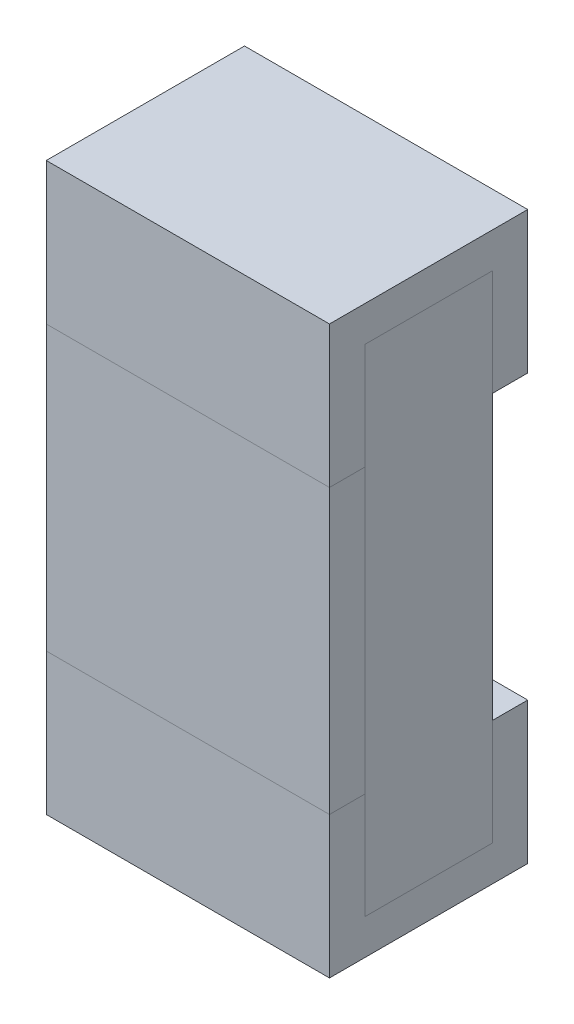
ISO-10303-21;
HEADER;
FILE_DESCRIPTION(('STEP AP214'),'2;1');
FILE_NAME('part.step','',(''),(''),'','','');
FILE_SCHEMA(('AUTOMOTIVE_DESIGN { 1 0 10303 214 1 1 1 1 }'));
ENDSEC;
DATA;
#1=APPLICATION_CONTEXT('core data for automotive mechanical design processes');
#2=APPLICATION_PROTOCOL_DEFINITION('international standard','automotive_design',2000,#1);
#3=PRODUCT_CONTEXT('',#1,'mechanical');
#4=PRODUCT('Part','Part','',(#3));
#5=PRODUCT_RELATED_PRODUCT_CATEGORY('part','',(#4));
#6=PRODUCT_DEFINITION_FORMATION('','',#4);
#7=PRODUCT_DEFINITION_CONTEXT('part definition',#1,'design');
#8=PRODUCT_DEFINITION('design','',#6,#7);
#9=PRODUCT_DEFINITION_SHAPE('','',#8);
#10=(LENGTH_UNIT() NAMED_UNIT(*) SI_UNIT(.MILLI.,.METRE.));
#11=(NAMED_UNIT(*) PLANE_ANGLE_UNIT() SI_UNIT($,.RADIAN.));
#12=(NAMED_UNIT(*) SI_UNIT($,.STERADIAN.) SOLID_ANGLE_UNIT());
#13=UNCERTAINTY_MEASURE_WITH_UNIT(LENGTH_MEASURE(1.E-05),#10,'distance_accuracy_value','');
#14=(GEOMETRIC_REPRESENTATION_CONTEXT(3) GLOBAL_UNCERTAINTY_ASSIGNED_CONTEXT((#13)) GLOBAL_UNIT_ASSIGNED_CONTEXT((#10,
#11,#12)) REPRESENTATION_CONTEXT('',''));
#15=CARTESIAN_POINT('',(0.,0.,0.));
#16=DIRECTION('',(0.,0.,1.));
#17=DIRECTION('',(1.,0.,0.));
#18=AXIS2_PLACEMENT_3D('',#15,#16,#17);
#19=CARTESIAN_POINT('',(-0.25,0.,0.));
#20=DIRECTION('',(1.,0.,0.));
#21=DIRECTION('',(0.,0.,-1.));
#22=AXIS2_PLACEMENT_3D('',#19,#20,#21);
#23=PLANE('',#22);
#24=DIRECTION('',(0.,-1.,0.));
#25=VECTOR('',#24,1.);
#26=CARTESIAN_POINT('',(-0.25,0.25,0.35));
#27=LINE('',#26,#25);
#28=CARTESIAN_POINT('',(-0.25,0.25,0.35));
#29=VERTEX_POINT('',#28);
#30=CARTESIAN_POINT('',(-0.25,0.,0.35));
#31=VERTEX_POINT('',#30);
#32=EDGE_CURVE('P0_E25',#29,#31,#27,.T.);
#33=ORIENTED_EDGE('',*,*,#32,.F.);
#34=DIRECTION('',(0.,0.,1.));
#35=VECTOR('',#34,1.);
#36=CARTESIAN_POINT('',(-0.25,0.25,0.2875));
#37=LINE('',#36,#35);
#38=CARTESIAN_POINT('',(-0.25,0.25,0.2875));
#39=VERTEX_POINT('',#38);
#40=EDGE_CURVE('P0_E171',#39,#29,#37,.T.);
#41=ORIENTED_EDGE('',*,*,#40,.F.);
#42=DIRECTION('',(0.,1.,0.));
#43=VECTOR('',#42,1.);
#44=CARTESIAN_POINT('',(-0.25,0.0625,0.2875));
#45=LINE('',#44,#43);
#46=CARTESIAN_POINT('',(-0.25,0.0625,0.2875));
#47=VERTEX_POINT('',#46);
#48=EDGE_CURVE('P0_E113',#47,#39,#45,.T.);
#49=ORIENTED_EDGE('',*,*,#48,.F.);
#50=DIRECTION('',(0.,0.,1.));
#51=VECTOR('',#50,1.);
#52=CARTESIAN_POINT('',(-0.25,0.0625,0.0625));
#53=LINE('',#52,#51);
#54=CARTESIAN_POINT('',(-0.25,0.0625,0.0625));
#55=VERTEX_POINT('',#54);
#56=EDGE_CURVE('P0_E124',#55,#47,#53,.T.);
#57=ORIENTED_EDGE('',*,*,#56,.F.);
#58=DIRECTION('',(0.,-1.,0.));
#59=VECTOR('',#58,1.);
#60=CARTESIAN_POINT('',(-0.25,0.25,0.0625));
#61=LINE('',#60,#59);
#62=CARTESIAN_POINT('',(-0.25,0.25,0.0625));
#63=VERTEX_POINT('',#62);
#64=EDGE_CURVE('P0_E127',#63,#55,#61,.T.);
#65=ORIENTED_EDGE('',*,*,#64,.F.);
#66=DIRECTION('',(0.,0.,1.));
#67=VECTOR('',#66,1.);
#68=CARTESIAN_POINT('',(-0.25,0.25,0.));
#69=LINE('',#68,#67);
#70=CARTESIAN_POINT('',(-0.25,0.25,0.));
#71=VERTEX_POINT('',#70);
#72=EDGE_CURVE('P0_E146',#71,#63,#69,.T.);
#73=ORIENTED_EDGE('',*,*,#72,.F.);
#74=DIRECTION('',(0.,1.,0.));
#75=VECTOR('',#74,1.);
#76=CARTESIAN_POINT('',(-0.25,0.,0.));
#77=LINE('',#76,#75);
#78=CARTESIAN_POINT('',(-0.25,0.,0.));
#79=VERTEX_POINT('',#78);
#80=EDGE_CURVE('P0_E142',#79,#71,#77,.T.);
#81=ORIENTED_EDGE('',*,*,#80,.F.);
#82=DIRECTION('',(0.,0.,-1.));
#83=VECTOR('',#82,1.);
#84=CARTESIAN_POINT('',(-0.25,0.,0.35));
#85=LINE('',#84,#83);
#86=EDGE_CURVE('P0_E196',#31,#79,#85,.T.);
#87=ORIENTED_EDGE('',*,*,#86,.F.);
#88=EDGE_LOOP('',(#33,#41,#49,#57,#65,#73,#81,#87));
#89=FACE_BOUND('',#88,.T.);
#90=ADVANCED_FACE('P0_F16',(#89),#23,.F.);
#91=CARTESIAN_POINT('',(0.25,0.,0.));
#92=DIRECTION('',(1.,0.,0.));
#93=DIRECTION('',(0.,0.,-1.));
#94=AXIS2_PLACEMENT_3D('',#91,#92,#93);
#95=PLANE('',#94);
#96=DIRECTION('',(0.,0.,-1.));
#97=VECTOR('',#96,1.);
#98=CARTESIAN_POINT('',(0.25,0.,0.35));
#99=LINE('',#98,#97);
#100=CARTESIAN_POINT('',(0.25,0.,0.35));
#101=VERTEX_POINT('',#100);
#102=CARTESIAN_POINT('',(0.25,0.,0.));
#103=VERTEX_POINT('',#102);
#104=EDGE_CURVE('P0_E137',#101,#103,#99,.T.);
#105=ORIENTED_EDGE('',*,*,#104,.T.);
#106=DIRECTION('',(0.,1.,0.));
#107=VECTOR('',#106,1.);
#108=CARTESIAN_POINT('',(0.25,0.,0.));
#109=LINE('',#108,#107);
#110=CARTESIAN_POINT('',(0.25,0.25,0.));
#111=VERTEX_POINT('',#110);
#112=EDGE_CURVE('P0_E150',#103,#111,#109,.T.);
#113=ORIENTED_EDGE('',*,*,#112,.T.);
#114=DIRECTION('',(0.,0.,1.));
#115=VECTOR('',#114,1.);
#116=CARTESIAN_POINT('',(0.25,0.25,0.));
#117=LINE('',#116,#115);
#118=CARTESIAN_POINT('',(0.25,0.25,0.0625));
#119=VERTEX_POINT('',#118);
#120=EDGE_CURVE('P0_E119',#111,#119,#117,.T.);
#121=ORIENTED_EDGE('',*,*,#120,.T.);
#122=DIRECTION('',(0.,-1.,0.));
#123=VECTOR('',#122,1.);
#124=CARTESIAN_POINT('',(0.25,0.25,0.0625));
#125=LINE('',#124,#123);
#126=CARTESIAN_POINT('',(0.25,0.0625,0.0625));
#127=VERTEX_POINT('',#126);
#128=EDGE_CURVE('P0_E116',#119,#127,#125,.T.);
#129=ORIENTED_EDGE('',*,*,#128,.T.);
#130=DIRECTION('',(0.,0.,1.));
#131=VECTOR('',#130,1.);
#132=CARTESIAN_POINT('',(0.25,0.0625,0.0625));
#133=LINE('',#132,#131);
#134=CARTESIAN_POINT('',(0.25,0.0625,0.2875));
#135=VERTEX_POINT('',#134);
#136=EDGE_CURVE('P0_E101',#127,#135,#133,.T.);
#137=ORIENTED_EDGE('',*,*,#136,.T.);
#138=DIRECTION('',(0.,1.,0.));
#139=VECTOR('',#138,1.);
#140=CARTESIAN_POINT('',(0.25,0.0625,0.2875));
#141=LINE('',#140,#139);
#142=CARTESIAN_POINT('',(0.25,0.25,0.2875));
#143=VERTEX_POINT('',#142);
#144=EDGE_CURVE('P0_E168',#135,#143,#141,.T.);
#145=ORIENTED_EDGE('',*,*,#144,.T.);
#146=DIRECTION('',(0.,0.,1.));
#147=VECTOR('',#146,1.);
#148=CARTESIAN_POINT('',(0.25,0.25,0.2875));
#149=LINE('',#148,#147);
#150=CARTESIAN_POINT('',(0.25,0.25,0.35));
#151=VERTEX_POINT('',#150);
#152=EDGE_CURVE('P0_E178',#143,#151,#149,.T.);
#153=ORIENTED_EDGE('',*,*,#152,.T.);
#154=DIRECTION('',(0.,-1.,0.));
#155=VECTOR('',#154,1.);
#156=CARTESIAN_POINT('',(0.25,0.25,0.35));
#157=LINE('',#156,#155);
#158=EDGE_CURVE('P0_E11',#151,#101,#157,.T.);
#159=ORIENTED_EDGE('',*,*,#158,.T.);
#160=EDGE_LOOP('',(#105,#113,#121,#129,#137,#145,#153,#159));
#161=FACE_BOUND('',#160,.T.);
#162=ADVANCED_FACE('P0_F18',(#161),#95,.T.);
#163=CARTESIAN_POINT('',(-0.25,0.25,0.35));
#164=DIRECTION('',(0.,0.,1.));
#165=DIRECTION('',(1.,0.,0.));
#166=AXIS2_PLACEMENT_3D('',#163,#164,#165);
#167=PLANE('',#166);
#168=ORIENTED_EDGE('',*,*,#32,.T.);
#169=DIRECTION('',(1.,0.,0.));
#170=VECTOR('',#169,1.);
#171=CARTESIAN_POINT('',(-0.25,0.,0.35));
#172=LINE('',#171,#170);
#173=EDGE_CURVE('P0_E139',#31,#101,#172,.T.);
#174=ORIENTED_EDGE('',*,*,#173,.T.);
#175=ORIENTED_EDGE('',*,*,#158,.F.);
#176=DIRECTION('',(1.,0.,0.));
#177=VECTOR('',#176,1.);
#178=CARTESIAN_POINT('',(-0.25,0.25,0.35));
#179=LINE('',#178,#177);
#180=EDGE_CURVE('P0_E175',#29,#151,#179,.T.);
#181=ORIENTED_EDGE('',*,*,#180,.F.);
#182=EDGE_LOOP('',(#168,#174,#175,#181));
#183=FACE_BOUND('',#182,.T.);
#184=ADVANCED_FACE('P0_F287',(#183),#167,.T.);
#185=CARTESIAN_POINT('',(-0.25,0.25,0.2875));
#186=DIRECTION('',(0.,1.,0.));
#187=DIRECTION('',(1.,0.,0.));
#188=AXIS2_PLACEMENT_3D('',#185,#186,#187);
#189=PLANE('',#188);
#190=ORIENTED_EDGE('',*,*,#40,.T.);
#191=ORIENTED_EDGE('',*,*,#180,.T.);
#192=ORIENTED_EDGE('',*,*,#152,.F.);
#193=DIRECTION('',(1.,0.,0.));
#194=VECTOR('',#193,1.);
#195=CARTESIAN_POINT('',(-0.25,0.25,0.2875));
#196=LINE('',#195,#194);
#197=EDGE_CURVE('P0_E164',#39,#143,#196,.T.);
#198=ORIENTED_EDGE('',*,*,#197,.F.);
#199=EDGE_LOOP('',(#190,#191,#192,#198));
#200=FACE_BOUND('',#199,.T.);
#201=ADVANCED_FACE('P0_F292',(#200),#189,.T.);
#202=CARTESIAN_POINT('',(-0.25,0.0625,0.2875));
#203=DIRECTION('',(0.,0.,-1.));
#204=DIRECTION('',(-1.,0.,0.));
#205=AXIS2_PLACEMENT_3D('',#202,#203,#204);
#206=PLANE('',#205);
#207=ORIENTED_EDGE('',*,*,#48,.T.);
#208=ORIENTED_EDGE('',*,*,#197,.T.);
#209=ORIENTED_EDGE('',*,*,#144,.F.);
#210=DIRECTION('',(1.,0.,0.));
#211=VECTOR('',#210,1.);
#212=CARTESIAN_POINT('',(-0.25,0.0625,0.2875));
#213=LINE('',#212,#211);
#214=EDGE_CURVE('P0_E109',#47,#135,#213,.T.);
#215=ORIENTED_EDGE('',*,*,#214,.F.);
#216=EDGE_LOOP('',(#207,#208,#209,#215));
#217=FACE_BOUND('',#216,.T.);
#218=ADVANCED_FACE('P0_F332',(#217),#206,.T.);
#219=CARTESIAN_POINT('',(-0.25,0.0625,0.0625));
#220=DIRECTION('',(0.,1.,0.));
#221=DIRECTION('',(0.,0.,-1.));
#222=AXIS2_PLACEMENT_3D('',#219,#220,#221);
#223=PLANE('',#222);
#224=ORIENTED_EDGE('',*,*,#56,.T.);
#225=ORIENTED_EDGE('',*,*,#214,.T.);
#226=ORIENTED_EDGE('',*,*,#136,.F.);
#227=DIRECTION('',(1.,0.,0.));
#228=VECTOR('',#227,1.);
#229=CARTESIAN_POINT('',(-0.25,0.0625,0.0625));
#230=LINE('',#229,#228);
#231=EDGE_CURVE('P0_E106',#55,#127,#230,.T.);
#232=ORIENTED_EDGE('',*,*,#231,.F.);
#233=EDGE_LOOP('',(#224,#225,#226,#232));
#234=FACE_BOUND('',#233,.T.);
#235=ADVANCED_FACE('P0_F104',(#234),#223,.T.);
#236=CARTESIAN_POINT('',(-0.25,0.25,0.0625));
#237=DIRECTION('',(0.,0.,1.));
#238=DIRECTION('',(1.,0.,0.));
#239=AXIS2_PLACEMENT_3D('',#236,#237,#238);
#240=PLANE('',#239);
#241=ORIENTED_EDGE('',*,*,#64,.T.);
#242=ORIENTED_EDGE('',*,*,#231,.T.);
#243=ORIENTED_EDGE('',*,*,#128,.F.);
#244=DIRECTION('',(1.,0.,0.));
#245=VECTOR('',#244,1.);
#246=CARTESIAN_POINT('',(-0.25,0.25,0.0625));
#247=LINE('',#246,#245);
#248=EDGE_CURVE('P0_E143',#63,#119,#247,.T.);
#249=ORIENTED_EDGE('',*,*,#248,.F.);
#250=EDGE_LOOP('',(#241,#242,#243,#249));
#251=FACE_BOUND('',#250,.T.);
#252=ADVANCED_FACE('P0_F126',(#251),#240,.T.);
#253=CARTESIAN_POINT('',(-0.25,0.25,0.));
#254=DIRECTION('',(0.,1.,0.));
#255=DIRECTION('',(0.,0.,-1.));
#256=AXIS2_PLACEMENT_3D('',#253,#254,#255);
#257=PLANE('',#256);
#258=ORIENTED_EDGE('',*,*,#72,.T.);
#259=ORIENTED_EDGE('',*,*,#248,.T.);
#260=ORIENTED_EDGE('',*,*,#120,.F.);
#261=DIRECTION('',(1.,0.,0.));
#262=VECTOR('',#261,1.);
#263=CARTESIAN_POINT('',(-0.25,0.25,0.));
#264=LINE('',#263,#262);
#265=EDGE_CURVE('P0_E147',#71,#111,#264,.T.);
#266=ORIENTED_EDGE('',*,*,#265,.F.);
#267=EDGE_LOOP('',(#258,#259,#260,#266));
#268=FACE_BOUND('',#267,.T.);
#269=ADVANCED_FACE('P0_F303',(#268),#257,.T.);
#270=CARTESIAN_POINT('',(-0.25,0.,0.));
#271=DIRECTION('',(0.,0.,-1.));
#272=DIRECTION('',(-1.,0.,0.));
#273=AXIS2_PLACEMENT_3D('',#270,#271,#272);
#274=PLANE('',#273);
#275=ORIENTED_EDGE('',*,*,#80,.T.);
#276=ORIENTED_EDGE('',*,*,#265,.T.);
#277=ORIENTED_EDGE('',*,*,#112,.F.);
#278=DIRECTION('',(1.,0.,0.));
#279=VECTOR('',#278,1.);
#280=CARTESIAN_POINT('',(-0.25,0.,0.));
#281=LINE('',#280,#279);
#282=EDGE_CURVE('P0_E192',#79,#103,#281,.T.);
#283=ORIENTED_EDGE('',*,*,#282,.F.);
#284=EDGE_LOOP('',(#275,#276,#277,#283));
#285=FACE_BOUND('',#284,.T.);
#286=ADVANCED_FACE('P0_F207',(#285),#274,.T.);
#287=CARTESIAN_POINT('',(-0.25,0.,0.35));
#288=DIRECTION('',(0.,-1.,0.));
#289=DIRECTION('',(0.,0.,-1.));
#290=AXIS2_PLACEMENT_3D('',#287,#288,#289);
#291=PLANE('',#290);
#292=ORIENTED_EDGE('',*,*,#86,.T.);
#293=ORIENTED_EDGE('',*,*,#282,.T.);
#294=ORIENTED_EDGE('',*,*,#104,.F.);
#295=ORIENTED_EDGE('',*,*,#173,.F.);
#296=EDGE_LOOP('',(#292,#293,#294,#295));
#297=FACE_BOUND('',#296,.T.);
#298=ADVANCED_FACE('P0_F202',(#297),#291,.T.);
#299=CLOSED_SHELL('',(#90,#162,#184,#201,#218,#235,#252,#269,#286,#298));
#300=MANIFOLD_SOLID_BREP('P0_B1',#299);
#301=CARTESIAN_POINT('',(-0.25,0.75,0.));
#302=DIRECTION('',(0.,1.,0.));
#303=DIRECTION('',(0.,0.,-1.));
#304=AXIS2_PLACEMENT_3D('',#301,#302,#303);
#305=PLANE('',#304);
#306=DIRECTION('',(1.,0.,0.));
#307=VECTOR('',#306,1.);
#308=CARTESIAN_POINT('',(-0.25,0.75,0.));
#309=LINE('',#308,#307);
#310=CARTESIAN_POINT('',(-0.25,0.75,0.));
#311=VERTEX_POINT('',#310);
#312=CARTESIAN_POINT('',(0.25,0.75,0.));
#313=VERTEX_POINT('',#312);
#314=EDGE_CURVE('P1_E104',#311,#313,#309,.T.);
#315=ORIENTED_EDGE('',*,*,#314,.T.);
#316=DIRECTION('',(0.,0.,1.));
#317=VECTOR('',#316,1.);
#318=CARTESIAN_POINT('',(0.25,0.75,0.));
#319=LINE('',#318,#317);
#320=CARTESIAN_POINT('',(0.25,0.75,0.0625));
#321=VERTEX_POINT('',#320);
#322=EDGE_CURVE('P1_E81',#313,#321,#319,.T.);
#323=ORIENTED_EDGE('',*,*,#322,.T.);
#324=DIRECTION('',(1.,0.,0.));
#325=VECTOR('',#324,1.);
#326=CARTESIAN_POINT('',(-0.25,0.75,0.0625));
#327=LINE('',#326,#325);
#328=CARTESIAN_POINT('',(-0.25,0.75,0.0625));
#329=VERTEX_POINT('',#328);
#330=EDGE_CURVE('P1_E11',#329,#321,#327,.T.);
#331=ORIENTED_EDGE('',*,*,#330,.F.);
#332=DIRECTION('',(0.,0.,1.));
#333=VECTOR('',#332,1.);
#334=CARTESIAN_POINT('',(-0.25,0.75,0.));
#335=LINE('',#334,#333);
#336=EDGE_CURVE('P1_E78',#311,#329,#335,.T.);
#337=ORIENTED_EDGE('',*,*,#336,.F.);
#338=EDGE_LOOP('',(#315,#323,#331,#337));
#339=FACE_BOUND('',#338,.T.);
#340=ADVANCED_FACE('P1_F16',(#339),#305,.F.);
#341=CARTESIAN_POINT('',(-0.25,0.75,0.0625));
#342=DIRECTION('',(0.,0.,-1.));
#343=DIRECTION('',(-1.,0.,0.));
#344=AXIS2_PLACEMENT_3D('',#341,#342,#343);
#345=PLANE('',#344);
#346=ORIENTED_EDGE('',*,*,#330,.T.);
#347=DIRECTION('',(0.,1.,0.));
#348=VECTOR('',#347,1.);
#349=CARTESIAN_POINT('',(0.25,0.75,0.0625));
#350=LINE('',#349,#348);
#351=CARTESIAN_POINT('',(0.25,0.9375,0.0625));
#352=VERTEX_POINT('',#351);
#353=EDGE_CURVE('P1_E140',#321,#352,#350,.T.);
#354=ORIENTED_EDGE('',*,*,#353,.T.);
#355=DIRECTION('',(1.,0.,0.));
#356=VECTOR('',#355,1.);
#357=CARTESIAN_POINT('',(-0.25,0.9375,0.0625));
#358=LINE('',#357,#356);
#359=CARTESIAN_POINT('',(-0.25,0.9375,0.0625));
#360=VERTEX_POINT('',#359);
#361=EDGE_CURVE('P1_E24',#360,#352,#358,.T.);
#362=ORIENTED_EDGE('',*,*,#361,.F.);
#363=DIRECTION('',(0.,1.,0.));
#364=VECTOR('',#363,1.);
#365=CARTESIAN_POINT('',(-0.25,0.75,0.0625));
#366=LINE('',#365,#364);
#367=EDGE_CURVE('P1_E86',#329,#360,#366,.T.);
#368=ORIENTED_EDGE('',*,*,#367,.F.);
#369=EDGE_LOOP('',(#346,#354,#362,#368));
#370=FACE_BOUND('',#369,.T.);
#371=ADVANCED_FACE('P1_F87',(#370),#345,.F.);
#372=CARTESIAN_POINT('',(-0.25,0.9375,0.0625));
#373=DIRECTION('',(0.,1.,0.));
#374=DIRECTION('',(0.,0.,-1.));
#375=AXIS2_PLACEMENT_3D('',#372,#373,#374);
#376=PLANE('',#375);
#377=ORIENTED_EDGE('',*,*,#361,.T.);
#378=DIRECTION('',(0.,0.,1.));
#379=VECTOR('',#378,1.);
#380=CARTESIAN_POINT('',(0.25,0.9375,0.0625));
#381=LINE('',#380,#379);
#382=CARTESIAN_POINT('',(0.25,0.9375,0.2875));
#383=VERTEX_POINT('',#382);
#384=EDGE_CURVE('P1_E137',#352,#383,#381,.T.);
#385=ORIENTED_EDGE('',*,*,#384,.T.);
#386=DIRECTION('',(1.,0.,0.));
#387=VECTOR('',#386,1.);
#388=CARTESIAN_POINT('',(-0.25,0.9375,0.2875));
#389=LINE('',#388,#387);
#390=CARTESIAN_POINT('',(-0.25,0.9375,0.2875));
#391=VERTEX_POINT('',#390);
#392=EDGE_CURVE('P1_E49',#391,#383,#389,.T.);
#393=ORIENTED_EDGE('',*,*,#392,.F.);
#394=DIRECTION('',(0.,0.,1.));
#395=VECTOR('',#394,1.);
#396=CARTESIAN_POINT('',(-0.25,0.9375,0.0625));
#397=LINE('',#396,#395);
#398=EDGE_CURVE('P1_E91',#360,#391,#397,.T.);
#399=ORIENTED_EDGE('',*,*,#398,.F.);
#400=EDGE_LOOP('',(#377,#385,#393,#399));
#401=FACE_BOUND('',#400,.T.);
#402=ADVANCED_FACE('P1_F164',(#401),#376,.F.);
#403=CARTESIAN_POINT('',(-0.25,0.9375,0.2875));
#404=DIRECTION('',(0.,0.,1.));
#405=DIRECTION('',(0.,-1.,0.));
#406=AXIS2_PLACEMENT_3D('',#403,#404,#405);
#407=PLANE('',#406);
#408=ORIENTED_EDGE('',*,*,#392,.T.);
#409=DIRECTION('',(0.,-1.,0.));
#410=VECTOR('',#409,1.);
#411=CARTESIAN_POINT('',(0.25,0.9375,0.2875));
#412=LINE('',#411,#410);
#413=CARTESIAN_POINT('',(0.25,0.75,0.2875));
#414=VERTEX_POINT('',#413);
#415=EDGE_CURVE('P1_E108',#383,#414,#412,.T.);
#416=ORIENTED_EDGE('',*,*,#415,.T.);
#417=DIRECTION('',(1.,0.,0.));
#418=VECTOR('',#417,1.);
#419=CARTESIAN_POINT('',(-0.25,0.75,0.2875));
#420=LINE('',#419,#418);
#421=CARTESIAN_POINT('',(-0.25,0.75,0.2875));
#422=VERTEX_POINT('',#421);
#423=EDGE_CURVE('P1_E36',#422,#414,#420,.T.);
#424=ORIENTED_EDGE('',*,*,#423,.F.);
#425=DIRECTION('',(0.,-1.,0.));
#426=VECTOR('',#425,1.);
#427=CARTESIAN_POINT('',(-0.25,0.9375,0.2875));
#428=LINE('',#427,#426);
#429=EDGE_CURVE('P1_E150',#391,#422,#428,.T.);
#430=ORIENTED_EDGE('',*,*,#429,.F.);
#431=EDGE_LOOP('',(#408,#416,#424,#430));
#432=FACE_BOUND('',#431,.T.);
#433=ADVANCED_FACE('P1_F247',(#432),#407,.F.);
#434=CARTESIAN_POINT('',(-0.25,0.75,0.2875));
#435=DIRECTION('',(0.,1.,0.));
#436=DIRECTION('',(0.,0.,-1.));
#437=AXIS2_PLACEMENT_3D('',#434,#435,#436);
#438=PLANE('',#437);
#439=ORIENTED_EDGE('',*,*,#423,.T.);
#440=DIRECTION('',(0.,0.,1.));
#441=VECTOR('',#440,1.);
#442=CARTESIAN_POINT('',(0.25,0.75,0.2875));
#443=LINE('',#442,#441);
#444=CARTESIAN_POINT('',(0.25,0.75,0.35));
#445=VERTEX_POINT('',#444);
#446=EDGE_CURVE('P1_E133',#414,#445,#443,.T.);
#447=ORIENTED_EDGE('',*,*,#446,.T.);
#448=DIRECTION('',(1.,0.,0.));
#449=VECTOR('',#448,1.);
#450=CARTESIAN_POINT('',(-0.25,0.75,0.35));
#451=LINE('',#450,#449);
#452=CARTESIAN_POINT('',(-0.25,0.75,0.35));
#453=VERTEX_POINT('',#452);
#454=EDGE_CURVE('P1_E117',#453,#445,#451,.T.);
#455=ORIENTED_EDGE('',*,*,#454,.F.);
#456=DIRECTION('',(0.,0.,1.));
#457=VECTOR('',#456,1.);
#458=CARTESIAN_POINT('',(-0.25,0.75,0.2875));
#459=LINE('',#458,#457);
#460=EDGE_CURVE('P1_E154',#422,#453,#459,.T.);
#461=ORIENTED_EDGE('',*,*,#460,.F.);
#462=EDGE_LOOP('',(#439,#447,#455,#461));
#463=FACE_BOUND('',#462,.T.);
#464=ADVANCED_FACE('P1_F246',(#463),#438,.F.);
#465=CARTESIAN_POINT('',(-0.25,1.,0.));
#466=DIRECTION('',(-1.,0.,0.));
#467=DIRECTION('',(0.,1.,0.));
#468=AXIS2_PLACEMENT_3D('',#465,#466,#467);
#469=PLANE('',#468);
#470=DIRECTION('',(0.,0.,-1.));
#471=VECTOR('',#470,1.);
#472=CARTESIAN_POINT('',(-0.25,1.,0.35));
#473=LINE('',#472,#471);
#474=CARTESIAN_POINT('',(-0.25,1.,0.35));
#475=VERTEX_POINT('',#474);
#476=CARTESIAN_POINT('',(-0.25,1.,0.));
#477=VERTEX_POINT('',#476);
#478=EDGE_CURVE('P1_E114',#475,#477,#473,.T.);
#479=ORIENTED_EDGE('',*,*,#478,.T.);
#480=DIRECTION('',(0.,-1.,0.));
#481=VECTOR('',#480,1.);
#482=CARTESIAN_POINT('',(-0.25,1.,0.));
#483=LINE('',#482,#481);
#484=EDGE_CURVE('P1_E96',#477,#311,#483,.T.);
#485=ORIENTED_EDGE('',*,*,#484,.T.);
#486=ORIENTED_EDGE('',*,*,#336,.T.);
#487=ORIENTED_EDGE('',*,*,#367,.T.);
#488=ORIENTED_EDGE('',*,*,#398,.T.);
#489=ORIENTED_EDGE('',*,*,#429,.T.);
#490=ORIENTED_EDGE('',*,*,#460,.T.);
#491=DIRECTION('',(0.,1.,0.));
#492=VECTOR('',#491,1.);
#493=CARTESIAN_POINT('',(-0.25,0.75,0.35));
#494=LINE('',#493,#492);
#495=EDGE_CURVE('P1_E129',#453,#475,#494,.T.);
#496=ORIENTED_EDGE('',*,*,#495,.T.);
#497=EDGE_LOOP('',(#479,#485,#486,#487,#488,#489,#490,#496));
#498=FACE_BOUND('',#497,.T.);
#499=ADVANCED_FACE('P1_F94',(#498),#469,.T.);
#500=CARTESIAN_POINT('',(-0.25,1.,0.));
#501=DIRECTION('',(0.,0.,1.));
#502=DIRECTION('',(1.,0.,0.));
#503=AXIS2_PLACEMENT_3D('',#500,#501,#502);
#504=PLANE('',#503);
#505=DIRECTION('',(1.,0.,0.));
#506=VECTOR('',#505,1.);
#507=CARTESIAN_POINT('',(-0.25,1.,0.));
#508=LINE('',#507,#506);
#509=CARTESIAN_POINT('',(0.25,1.,0.));
#510=VERTEX_POINT('',#509);
#511=EDGE_CURVE('P1_E110',#477,#510,#508,.T.);
#512=ORIENTED_EDGE('',*,*,#511,.T.);
#513=DIRECTION('',(0.,-1.,0.));
#514=VECTOR('',#513,1.);
#515=CARTESIAN_POINT('',(0.25,1.,0.));
#516=LINE('',#515,#514);
#517=EDGE_CURVE('P1_E125',#510,#313,#516,.T.);
#518=ORIENTED_EDGE('',*,*,#517,.T.);
#519=ORIENTED_EDGE('',*,*,#314,.F.);
#520=ORIENTED_EDGE('',*,*,#484,.F.);
#521=EDGE_LOOP('',(#512,#518,#519,#520));
#522=FACE_BOUND('',#521,.T.);
#523=ADVANCED_FACE('P1_F267',(#522),#504,.F.);
#524=CARTESIAN_POINT('',(0.25,1.,0.));
#525=DIRECTION('',(-1.,0.,0.));
#526=DIRECTION('',(0.,1.,0.));
#527=AXIS2_PLACEMENT_3D('',#524,#525,#526);
#528=PLANE('',#527);
#529=DIRECTION('',(0.,1.,0.));
#530=VECTOR('',#529,1.);
#531=CARTESIAN_POINT('',(0.25,0.75,0.35));
#532=LINE('',#531,#530);
#533=CARTESIAN_POINT('',(0.25,1.,0.35));
#534=VERTEX_POINT('',#533);
#535=EDGE_CURVE('P1_E122',#445,#534,#532,.T.);
#536=ORIENTED_EDGE('',*,*,#535,.F.);
#537=ORIENTED_EDGE('',*,*,#446,.F.);
#538=ORIENTED_EDGE('',*,*,#415,.F.);
#539=ORIENTED_EDGE('',*,*,#384,.F.);
#540=ORIENTED_EDGE('',*,*,#353,.F.);
#541=ORIENTED_EDGE('',*,*,#322,.F.);
#542=ORIENTED_EDGE('',*,*,#517,.F.);
#543=DIRECTION('',(0.,0.,-1.));
#544=VECTOR('',#543,1.);
#545=CARTESIAN_POINT('',(0.25,1.,0.35));
#546=LINE('',#545,#544);
#547=EDGE_CURVE('P1_E115',#534,#510,#546,.T.);
#548=ORIENTED_EDGE('',*,*,#547,.F.);
#549=EDGE_LOOP('',(#536,#537,#538,#539,#540,#541,#542,#548));
#550=FACE_BOUND('',#549,.T.);
#551=ADVANCED_FACE('P1_F169',(#550),#528,.F.);
#552=CARTESIAN_POINT('',(-0.25,0.75,0.35));
#553=DIRECTION('',(0.,0.,-1.));
#554=DIRECTION('',(-1.,0.,0.));
#555=AXIS2_PLACEMENT_3D('',#552,#553,#554);
#556=PLANE('',#555);
#557=ORIENTED_EDGE('',*,*,#454,.T.);
#558=ORIENTED_EDGE('',*,*,#535,.T.);
#559=DIRECTION('',(1.,0.,0.));
#560=VECTOR('',#559,1.);
#561=CARTESIAN_POINT('',(-0.25,1.,0.35));
#562=LINE('',#561,#560);
#563=EDGE_CURVE('P1_E204',#475,#534,#562,.T.);
#564=ORIENTED_EDGE('',*,*,#563,.F.);
#565=ORIENTED_EDGE('',*,*,#495,.F.);
#566=EDGE_LOOP('',(#557,#558,#564,#565));
#567=FACE_BOUND('',#566,.T.);
#568=ADVANCED_FACE('P1_F226',(#567),#556,.F.);
#569=CARTESIAN_POINT('',(-0.25,1.,0.35));
#570=DIRECTION('',(0.,-1.,0.));
#571=DIRECTION('',(0.,0.,-1.));
#572=AXIS2_PLACEMENT_3D('',#569,#570,#571);
#573=PLANE('',#572);
#574=ORIENTED_EDGE('',*,*,#563,.T.);
#575=ORIENTED_EDGE('',*,*,#547,.T.);
#576=ORIENTED_EDGE('',*,*,#511,.F.);
#577=ORIENTED_EDGE('',*,*,#478,.F.);
#578=EDGE_LOOP('',(#574,#575,#576,#577));
#579=FACE_BOUND('',#578,.T.);
#580=ADVANCED_FACE('P1_F217',(#579),#573,.F.);
#581=CLOSED_SHELL('',(#340,#371,#402,#433,#464,#499,#523,#551,#568,#580));
#582=MANIFOLD_SOLID_BREP('P1_B1',#581);
#583=CARTESIAN_POINT('',(0.25,0.,0.));
#584=DIRECTION('',(1.,0.,0.));
#585=DIRECTION('',(0.,0.,-1.));
#586=AXIS2_PLACEMENT_3D('',#583,#584,#585);
#587=PLANE('',#586);
#588=DIRECTION('',(0.,-1.,0.));
#589=VECTOR('',#588,1.);
#590=CARTESIAN_POINT('',(0.25,0.9375,0.2875));
#591=LINE('',#590,#589);
#592=CARTESIAN_POINT('',(0.25,0.9375,0.2875));
#593=VERTEX_POINT('',#592);
#594=CARTESIAN_POINT('',(0.25,0.0625,0.2875));
#595=VERTEX_POINT('',#594);
#596=EDGE_CURVE('P2_E11',#593,#595,#591,.T.);
#597=ORIENTED_EDGE('',*,*,#596,.T.);
#598=DIRECTION('',(0.,0.,-1.));
#599=VECTOR('',#598,1.);
#600=CARTESIAN_POINT('',(0.25,0.0625,0.2875));
#601=LINE('',#600,#599);
#602=CARTESIAN_POINT('',(0.25,0.0625,0.0625));
#603=VERTEX_POINT('',#602);
#604=EDGE_CURVE('P2_E41',#595,#603,#601,.T.);
#605=ORIENTED_EDGE('',*,*,#604,.T.);
#606=DIRECTION('',(0.,1.,0.));
#607=VECTOR('',#606,1.);
#608=CARTESIAN_POINT('',(0.25,0.0625,0.0625));
#609=LINE('',#608,#607);
#610=CARTESIAN_POINT('',(0.25,0.9375,0.0625));
#611=VERTEX_POINT('',#610);
#612=EDGE_CURVE('P2_E102',#603,#611,#609,.T.);
#613=ORIENTED_EDGE('',*,*,#612,.T.);
#614=DIRECTION('',(0.,0.,1.));
#615=VECTOR('',#614,1.);
#616=CARTESIAN_POINT('',(0.25,0.9375,0.0625));
#617=LINE('',#616,#615);
#618=EDGE_CURVE('P2_E103',#611,#593,#617,.T.);
#619=ORIENTED_EDGE('',*,*,#618,.T.);
#620=EDGE_LOOP('',(#597,#605,#613,#619));
#621=FACE_BOUND('',#620,.T.);
#622=ADVANCED_FACE('P2_F16',(#621),#587,.T.);
#623=CARTESIAN_POINT('',(-1.25,0.9375,0.2875));
#624=DIRECTION('',(0.,0.,1.));
#625=DIRECTION('',(1.,0.,0.));
#626=AXIS2_PLACEMENT_3D('',#623,#624,#625);
#627=PLANE('',#626);
#628=DIRECTION('',(0.,1.,0.));
#629=VECTOR('',#628,1.);
#630=CARTESIAN_POINT('',(-0.25,0.9375,0.2875));
#631=LINE('',#630,#629);
#632=CARTESIAN_POINT('',(-0.25,0.0625,0.2875));
#633=VERTEX_POINT('',#632);
#634=CARTESIAN_POINT('',(-0.25,0.9375,0.2875));
#635=VERTEX_POINT('',#634);
#636=EDGE_CURVE('P2_E78',#633,#635,#631,.T.);
#637=ORIENTED_EDGE('',*,*,#636,.F.);
#638=DIRECTION('',(1.,0.,0.));
#639=VECTOR('',#638,1.);
#640=CARTESIAN_POINT('',(-0.25,0.0625,0.2875));
#641=LINE('',#640,#639);
#642=EDGE_CURVE('P2_E24',#633,#595,#641,.T.);
#643=ORIENTED_EDGE('',*,*,#642,.T.);
#644=ORIENTED_EDGE('',*,*,#596,.F.);
#645=DIRECTION('',(1.,0.,0.));
#646=VECTOR('',#645,1.);
#647=CARTESIAN_POINT('',(-0.25,0.9375,0.2875));
#648=LINE('',#647,#646);
#649=EDGE_CURVE('P2_E82',#635,#593,#648,.T.);
#650=ORIENTED_EDGE('',*,*,#649,.F.);
#651=EDGE_LOOP('',(#637,#643,#644,#650));
#652=FACE_BOUND('',#651,.T.);
#653=ADVANCED_FACE('P2_F84',(#652),#627,.T.);
#654=CARTESIAN_POINT('',(-1.25,0.0625,0.2875));
#655=DIRECTION('',(0.,-1.,0.));
#656=DIRECTION('',(0.,0.,-1.));
#657=AXIS2_PLACEMENT_3D('',#654,#655,#656);
#658=PLANE('',#657);
#659=DIRECTION('',(0.,0.,1.));
#660=VECTOR('',#659,1.);
#661=CARTESIAN_POINT('',(-0.25,0.0625,0.2875));
#662=LINE('',#661,#660);
#663=CARTESIAN_POINT('',(-0.25,0.0625,0.0625));
#664=VERTEX_POINT('',#663);
#665=EDGE_CURVE('P2_E69',#664,#633,#662,.T.);
#666=ORIENTED_EDGE('',*,*,#665,.F.);
#667=DIRECTION('',(1.,0.,0.));
#668=VECTOR('',#667,1.);
#669=CARTESIAN_POINT('',(-0.25,0.0625,0.0625));
#670=LINE('',#669,#668);
#671=EDGE_CURVE('P2_E110',#664,#603,#670,.T.);
#672=ORIENTED_EDGE('',*,*,#671,.T.);
#673=ORIENTED_EDGE('',*,*,#604,.F.);
#674=ORIENTED_EDGE('',*,*,#642,.F.);
#675=EDGE_LOOP('',(#666,#672,#673,#674));
#676=FACE_BOUND('',#675,.T.);
#677=ADVANCED_FACE('P2_F68',(#676),#658,.T.);
#678=CARTESIAN_POINT('',(-1.25,0.0625,0.0625));
#679=DIRECTION('',(0.,0.,-1.));
#680=DIRECTION('',(-1.,0.,0.));
#681=AXIS2_PLACEMENT_3D('',#678,#679,#680);
#682=PLANE('',#681);
#683=DIRECTION('',(0.,-1.,0.));
#684=VECTOR('',#683,1.);
#685=CARTESIAN_POINT('',(-0.25,0.0625,0.0625));
#686=LINE('',#685,#684);
#687=CARTESIAN_POINT('',(-0.25,0.9375,0.0625));
#688=VERTEX_POINT('',#687);
#689=EDGE_CURVE('P2_E80',#688,#664,#686,.T.);
#690=ORIENTED_EDGE('',*,*,#689,.F.);
#691=DIRECTION('',(1.,0.,0.));
#692=VECTOR('',#691,1.);
#693=CARTESIAN_POINT('',(-0.25,0.9375,0.0625));
#694=LINE('',#693,#692);
#695=EDGE_CURVE('P2_E98',#688,#611,#694,.T.);
#696=ORIENTED_EDGE('',*,*,#695,.T.);
#697=ORIENTED_EDGE('',*,*,#612,.F.);
#698=ORIENTED_EDGE('',*,*,#671,.F.);
#699=EDGE_LOOP('',(#690,#696,#697,#698));
#700=FACE_BOUND('',#699,.T.);
#701=ADVANCED_FACE('P2_F118',(#700),#682,.T.);
#702=CARTESIAN_POINT('',(-1.25,0.9375,0.0625));
#703=DIRECTION('',(0.,1.,0.));
#704=DIRECTION('',(1.,0.,0.));
#705=AXIS2_PLACEMENT_3D('',#702,#703,#704);
#706=PLANE('',#705);
#707=DIRECTION('',(0.,0.,-1.));
#708=VECTOR('',#707,1.);
#709=CARTESIAN_POINT('',(-0.25,0.9375,0.0625));
#710=LINE('',#709,#708);
#711=EDGE_CURVE('P2_E88',#635,#688,#710,.T.);
#712=ORIENTED_EDGE('',*,*,#711,.F.);
#713=ORIENTED_EDGE('',*,*,#649,.T.);
#714=ORIENTED_EDGE('',*,*,#618,.F.);
#715=ORIENTED_EDGE('',*,*,#695,.F.);
#716=EDGE_LOOP('',(#712,#713,#714,#715));
#717=FACE_BOUND('',#716,.T.);
#718=ADVANCED_FACE('P2_F121',(#717),#706,.T.);
#719=CARTESIAN_POINT('',(-0.25,0.,0.));
#720=DIRECTION('',(1.,0.,0.));
#721=DIRECTION('',(0.,0.,-1.));
#722=AXIS2_PLACEMENT_3D('',#719,#720,#721);
#723=PLANE('',#722);
#724=ORIENTED_EDGE('',*,*,#636,.T.);
#725=ORIENTED_EDGE('',*,*,#711,.T.);
#726=ORIENTED_EDGE('',*,*,#689,.T.);
#727=ORIENTED_EDGE('',*,*,#665,.T.);
#728=EDGE_LOOP('',(#724,#725,#726,#727));
#729=FACE_BOUND('',#728,.T.);
#730=ADVANCED_FACE('P2_F76',(#729),#723,.F.);
#731=CLOSED_SHELL('',(#622,#653,#677,#701,#718,#730));
#732=MANIFOLD_SOLID_BREP('P2_B1',#731);
#733=CARTESIAN_POINT('',(0.25,0.,0.));
#734=DIRECTION('',(1.,0.,0.));
#735=DIRECTION('',(0.,0.,-1.));
#736=AXIS2_PLACEMENT_3D('',#733,#734,#735);
#737=PLANE('',#736);
#738=DIRECTION('',(0.,-1.,0.));
#739=VECTOR('',#738,1.);
#740=CARTESIAN_POINT('',(0.25,0.75,0.35));
#741=LINE('',#740,#739);
#742=CARTESIAN_POINT('',(0.25,0.75,0.35));
#743=VERTEX_POINT('',#742);
#744=CARTESIAN_POINT('',(0.25,0.25,0.35));
#745=VERTEX_POINT('',#744);
#746=EDGE_CURVE('P3_E11',#743,#745,#741,.T.);
#747=ORIENTED_EDGE('',*,*,#746,.T.);
#748=DIRECTION('',(0.,0.,-1.));
#749=VECTOR('',#748,1.);
#750=CARTESIAN_POINT('',(0.25,0.25,0.35));
#751=LINE('',#750,#749);
#752=CARTESIAN_POINT('',(0.25,0.25,0.2875));
#753=VERTEX_POINT('',#752);
#754=EDGE_CURVE('P3_E103',#745,#753,#751,.T.);
#755=ORIENTED_EDGE('',*,*,#754,.T.);
#756=DIRECTION('',(0.,1.,0.));
#757=VECTOR('',#756,1.);
#758=CARTESIAN_POINT('',(0.25,0.25,0.2875));
#759=LINE('',#758,#757);
#760=CARTESIAN_POINT('',(0.25,0.75,0.2875));
#761=VERTEX_POINT('',#760);
#762=EDGE_CURVE('P3_E46',#753,#761,#759,.T.);
#763=ORIENTED_EDGE('',*,*,#762,.T.);
#764=DIRECTION('',(0.,0.,1.));
#765=VECTOR('',#764,1.);
#766=CARTESIAN_POINT('',(0.25,0.75,0.2875));
#767=LINE('',#766,#765);
#768=EDGE_CURVE('P3_E76',#761,#743,#767,.T.);
#769=ORIENTED_EDGE('',*,*,#768,.T.);
#770=EDGE_LOOP('',(#747,#755,#763,#769));
#771=FACE_BOUND('',#770,.T.);
#772=ADVANCED_FACE('P3_F16',(#771),#737,.T.);
#773=CARTESIAN_POINT('',(-1.25,0.75,0.35));
#774=DIRECTION('',(0.,0.,1.));
#775=DIRECTION('',(1.,0.,0.));
#776=AXIS2_PLACEMENT_3D('',#773,#774,#775);
#777=PLANE('',#776);
#778=DIRECTION('',(0.,1.,0.));
#779=VECTOR('',#778,1.);
#780=CARTESIAN_POINT('',(-0.25,0.75,0.35));
#781=LINE('',#780,#779);
#782=CARTESIAN_POINT('',(-0.25,0.25,0.35));
#783=VERTEX_POINT('',#782);
#784=CARTESIAN_POINT('',(-0.25,0.75,0.35));
#785=VERTEX_POINT('',#784);
#786=EDGE_CURVE('P3_E93',#783,#785,#781,.T.);
#787=ORIENTED_EDGE('',*,*,#786,.F.);
#788=DIRECTION('',(1.,0.,0.));
#789=VECTOR('',#788,1.);
#790=CARTESIAN_POINT('',(-0.25,0.25,0.35));
#791=LINE('',#790,#789);
#792=EDGE_CURVE('P3_E25',#783,#745,#791,.T.);
#793=ORIENTED_EDGE('',*,*,#792,.T.);
#794=ORIENTED_EDGE('',*,*,#746,.F.);
#795=DIRECTION('',(1.,0.,0.));
#796=VECTOR('',#795,1.);
#797=CARTESIAN_POINT('',(-0.25,0.75,0.35));
#798=LINE('',#797,#796);
#799=EDGE_CURVE('P3_E106',#785,#743,#798,.T.);
#800=ORIENTED_EDGE('',*,*,#799,.F.);
#801=EDGE_LOOP('',(#787,#793,#794,#800));
#802=FACE_BOUND('',#801,.T.);
#803=ADVANCED_FACE('P3_F153',(#802),#777,.T.);
#804=CARTESIAN_POINT('',(-1.25,0.25,0.35));
#805=DIRECTION('',(0.,-1.,0.));
#806=DIRECTION('',(0.,0.,-1.));
#807=AXIS2_PLACEMENT_3D('',#804,#805,#806);
#808=PLANE('',#807);
#809=DIRECTION('',(0.,0.,1.));
#810=VECTOR('',#809,1.);
#811=CARTESIAN_POINT('',(-0.25,0.25,0.35));
#812=LINE('',#811,#810);
#813=CARTESIAN_POINT('',(-0.25,0.25,0.2875));
#814=VERTEX_POINT('',#813);
#815=EDGE_CURVE('P3_E89',#814,#783,#812,.T.);
#816=ORIENTED_EDGE('',*,*,#815,.F.);
#817=DIRECTION('',(1.,0.,0.));
#818=VECTOR('',#817,1.);
#819=CARTESIAN_POINT('',(-0.25,0.25,0.2875));
#820=LINE('',#819,#818);
#821=EDGE_CURVE('P3_E84',#814,#753,#820,.T.);
#822=ORIENTED_EDGE('',*,*,#821,.T.);
#823=ORIENTED_EDGE('',*,*,#754,.F.);
#824=ORIENTED_EDGE('',*,*,#792,.F.);
#825=EDGE_LOOP('',(#816,#822,#823,#824));
#826=FACE_BOUND('',#825,.T.);
#827=ADVANCED_FACE('P3_F152',(#826),#808,.T.);
#828=CARTESIAN_POINT('',(-1.25,0.25,0.2875));
#829=DIRECTION('',(0.,0.,-1.));
#830=DIRECTION('',(-1.,0.,0.));
#831=AXIS2_PLACEMENT_3D('',#828,#829,#830);
#832=PLANE('',#831);
#833=DIRECTION('',(0.,-1.,0.));
#834=VECTOR('',#833,1.);
#835=CARTESIAN_POINT('',(-0.25,0.25,0.2875));
#836=LINE('',#835,#834);
#837=CARTESIAN_POINT('',(-0.25,0.75,0.2875));
#838=VERTEX_POINT('',#837);
#839=EDGE_CURVE('P3_E81',#838,#814,#836,.T.);
#840=ORIENTED_EDGE('',*,*,#839,.F.);
#841=DIRECTION('',(1.,0.,0.));
#842=VECTOR('',#841,1.);
#843=CARTESIAN_POINT('',(-0.25,0.75,0.2875));
#844=LINE('',#843,#842);
#845=EDGE_CURVE('P3_E69',#838,#761,#844,.T.);
#846=ORIENTED_EDGE('',*,*,#845,.T.);
#847=ORIENTED_EDGE('',*,*,#762,.F.);
#848=ORIENTED_EDGE('',*,*,#821,.F.);
#849=EDGE_LOOP('',(#840,#846,#847,#848));
#850=FACE_BOUND('',#849,.T.);
#851=ADVANCED_FACE('P3_F82',(#850),#832,.T.);
#852=CARTESIAN_POINT('',(-1.25,0.75,0.2875));
#853=DIRECTION('',(0.,1.,0.));
#854=DIRECTION('',(1.,0.,0.));
#855=AXIS2_PLACEMENT_3D('',#852,#853,#854);
#856=PLANE('',#855);
#857=DIRECTION('',(0.,0.,-1.));
#858=VECTOR('',#857,1.);
#859=CARTESIAN_POINT('',(-0.25,0.75,0.2875));
#860=LINE('',#859,#858);
#861=EDGE_CURVE('P3_E74',#785,#838,#860,.T.);
#862=ORIENTED_EDGE('',*,*,#861,.F.);
#863=ORIENTED_EDGE('',*,*,#799,.T.);
#864=ORIENTED_EDGE('',*,*,#768,.F.);
#865=ORIENTED_EDGE('',*,*,#845,.F.);
#866=EDGE_LOOP('',(#862,#863,#864,#865));
#867=FACE_BOUND('',#866,.T.);
#868=ADVANCED_FACE('P3_F71',(#867),#856,.T.);
#869=CARTESIAN_POINT('',(-0.25,0.,0.));
#870=DIRECTION('',(1.,0.,0.));
#871=DIRECTION('',(0.,0.,-1.));
#872=AXIS2_PLACEMENT_3D('',#869,#870,#871);
#873=PLANE('',#872);
#874=ORIENTED_EDGE('',*,*,#786,.T.);
#875=ORIENTED_EDGE('',*,*,#861,.T.);
#876=ORIENTED_EDGE('',*,*,#839,.T.);
#877=ORIENTED_EDGE('',*,*,#815,.T.);
#878=EDGE_LOOP('',(#874,#875,#876,#877));
#879=FACE_BOUND('',#878,.T.);
#880=ADVANCED_FACE('P3_F91',(#879),#873,.F.);
#881=CLOSED_SHELL('',(#772,#803,#827,#851,#868,#880));
#882=MANIFOLD_SOLID_BREP('P3_B1',#881);
#883=ADVANCED_BREP_SHAPE_REPRESENTATION('',(#18,#300,#582,#732,#882),#14);
#884=SHAPE_DEFINITION_REPRESENTATION(#9,#883);
ENDSEC;
END-ISO-10303-21;
